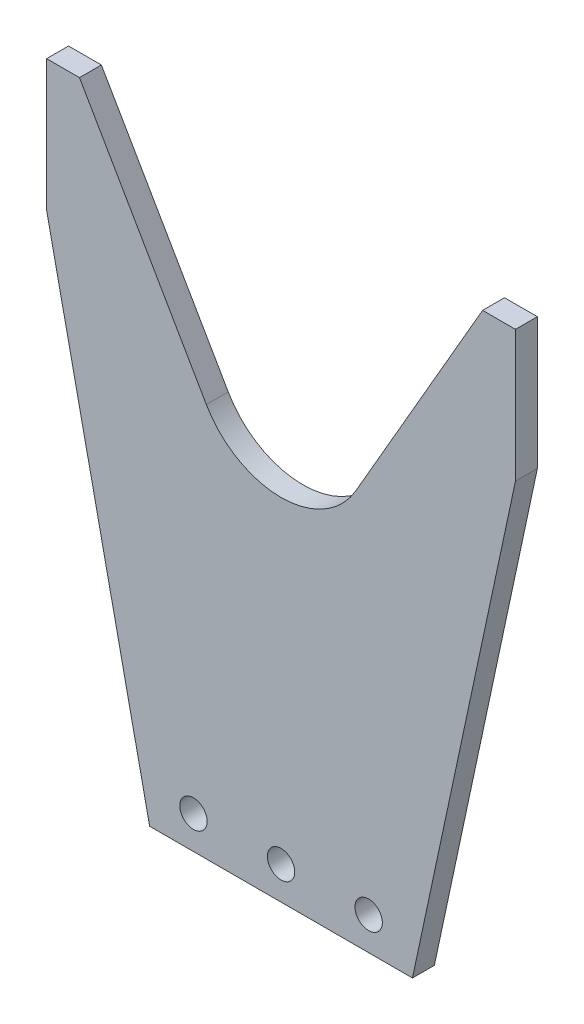
ISO-10303-21;
HEADER;
FILE_DESCRIPTION(('STEP AP214'),'2;1');
FILE_NAME('part.step','',(''),(''),'','','');
FILE_SCHEMA(('AUTOMOTIVE_DESIGN { 1 0 10303 214 1 1 1 1 }'));
ENDSEC;
DATA;
#1=APPLICATION_CONTEXT('core data for automotive mechanical design processes');
#2=APPLICATION_PROTOCOL_DEFINITION('international standard','automotive_design',2000,#1);
#3=PRODUCT_CONTEXT('',#1,'mechanical');
#4=PRODUCT('Part','Part','',(#3));
#5=PRODUCT_RELATED_PRODUCT_CATEGORY('part','',(#4));
#6=PRODUCT_DEFINITION_FORMATION('','',#4);
#7=PRODUCT_DEFINITION_CONTEXT('part definition',#1,'design');
#8=PRODUCT_DEFINITION('design','',#6,#7);
#9=PRODUCT_DEFINITION_SHAPE('','',#8);
#10=(LENGTH_UNIT() NAMED_UNIT(*) SI_UNIT(.MILLI.,.METRE.));
#11=(NAMED_UNIT(*) PLANE_ANGLE_UNIT() SI_UNIT($,.RADIAN.));
#12=(NAMED_UNIT(*) SI_UNIT($,.STERADIAN.) SOLID_ANGLE_UNIT());
#13=UNCERTAINTY_MEASURE_WITH_UNIT(LENGTH_MEASURE(1.E-05),#10,'distance_accuracy_value','');
#14=(GEOMETRIC_REPRESENTATION_CONTEXT(3) GLOBAL_UNCERTAINTY_ASSIGNED_CONTEXT((#13)) GLOBAL_UNIT_ASSIGNED_CONTEXT((#10,
#11,#12)) REPRESENTATION_CONTEXT('',''));
#15=CARTESIAN_POINT('',(0.,0.,0.));
#16=DIRECTION('',(0.,0.,1.));
#17=DIRECTION('',(1.,0.,0.));
#18=AXIS2_PLACEMENT_3D('',#15,#16,#17);
#19=CARTESIAN_POINT('',(0.,0.,6.35));
#20=DIRECTION('',(0.,0.,-1.));
#21=DIRECTION('',(-1.,0.,0.));
#22=AXIS2_PLACEMENT_3D('',#19,#20,#21);
#23=CYLINDRICAL_SURFACE('',#22,25.019);
#24=CARTESIAN_POINT('',(0.,0.,0.));
#25=DIRECTION('',(0.,0.,-1.));
#26=DIRECTION('',(1.,0.,0.));
#27=AXIS2_PLACEMENT_3D('',#24,#25,#26);
#28=CIRCLE('',#27,25.019);
#29=CARTESIAN_POINT('',(21.6670895772829,-12.5094999999999,0.));
#30=VERTEX_POINT('',#29);
#31=CARTESIAN_POINT('',(-21.6670895772829,-12.5095,0.));
#32=VERTEX_POINT('',#31);
#33=EDGE_CURVE('E143',#30,#32,#28,.T.);
#34=ORIENTED_EDGE('',*,*,#33,.T.);
#35=DIRECTION('',(0.,0.,-1.));
#36=VECTOR('',#35,1.);
#37=CARTESIAN_POINT('',(-21.6670895772829,-12.5095,6.35));
#38=LINE('',#37,#36);
#39=CARTESIAN_POINT('',(-21.6670895772829,-12.5095,6.35));
#40=VERTEX_POINT('',#39);
#41=EDGE_CURVE('E11',#40,#32,#38,.T.);
#42=ORIENTED_EDGE('',*,*,#41,.F.);
#43=CARTESIAN_POINT('',(0.,0.,6.35));
#44=DIRECTION('',(0.,0.,-1.));
#45=DIRECTION('',(1.,0.,0.));
#46=AXIS2_PLACEMENT_3D('',#43,#44,#45);
#47=CIRCLE('',#46,25.019);
#48=CARTESIAN_POINT('',(21.6670895772829,-12.5094999999999,6.35));
#49=VERTEX_POINT('',#48);
#50=EDGE_CURVE('E162',#49,#40,#47,.T.);
#51=ORIENTED_EDGE('',*,*,#50,.F.);
#52=DIRECTION('',(0.,0.,-1.));
#53=VECTOR('',#52,1.);
#54=CARTESIAN_POINT('',(21.6670895772829,-12.5094999999999,6.35));
#55=LINE('',#54,#53);
#56=EDGE_CURVE('E139',#49,#30,#55,.T.);
#57=ORIENTED_EDGE('',*,*,#56,.T.);
#58=EDGE_LOOP('',(#34,#42,#51,#57));
#59=FACE_BOUND('',#58,.T.);
#60=ADVANCED_FACE('F35',(#59),#23,.F.);
#61=CARTESIAN_POINT('',(-21.6670895772829,-12.5095,6.35));
#62=DIRECTION('',(-0.866025403784439,-0.499999999999998,0.));
#63=DIRECTION('',(0.499999999999998,-0.86602540378444,0.));
#64=AXIS2_PLACEMENT_3D('',#61,#62,#63);
#65=PLANE('',#64);
#66=DIRECTION('',(-0.499999999999998,0.86602540378444,0.));
#67=VECTOR('',#66,1.);
#68=CARTESIAN_POINT('',(-21.6670895772829,-12.5095,0.));
#69=LINE('',#68,#67);
#70=CARTESIAN_POINT('',(-58.4388168971046,51.181,0.));
#71=VERTEX_POINT('',#70);
#72=EDGE_CURVE('E146',#32,#71,#69,.T.);
#73=ORIENTED_EDGE('',*,*,#72,.T.);
#74=DIRECTION('',(0.,0.,-1.));
#75=VECTOR('',#74,1.);
#76=CARTESIAN_POINT('',(-58.4388168971046,51.181,6.35));
#77=LINE('',#76,#75);
#78=CARTESIAN_POINT('',(-58.4388168971046,51.181,6.35));
#79=VERTEX_POINT('',#78);
#80=EDGE_CURVE('E43',#79,#71,#77,.T.);
#81=ORIENTED_EDGE('',*,*,#80,.F.);
#82=DIRECTION('',(-0.499999999999998,0.86602540378444,0.));
#83=VECTOR('',#82,1.);
#84=CARTESIAN_POINT('',(-21.6670895772829,-12.5095,6.35));
#85=LINE('',#84,#83);
#86=EDGE_CURVE('E100',#40,#79,#85,.T.);
#87=ORIENTED_EDGE('',*,*,#86,.F.);
#88=ORIENTED_EDGE('',*,*,#41,.T.);
#89=EDGE_LOOP('',(#73,#81,#87,#88));
#90=FACE_BOUND('',#89,.T.);
#91=ADVANCED_FACE('F253',(#90),#65,.F.);
#92=CARTESIAN_POINT('',(-58.4388168971046,51.181,6.35));
#93=DIRECTION('',(0.,-1.,0.));
#94=DIRECTION('',(1.,0.,0.));
#95=AXIS2_PLACEMENT_3D('',#92,#93,#94);
#96=PLANE('',#95);
#97=DIRECTION('',(-1.,0.,0.));
#98=VECTOR('',#97,1.);
#99=CARTESIAN_POINT('',(-58.4388168971046,51.181,0.));
#100=LINE('',#99,#98);
#101=CARTESIAN_POINT('',(-67.9638168971046,51.181,0.));
#102=VERTEX_POINT('',#101);
#103=EDGE_CURVE('E149',#71,#102,#100,.T.);
#104=ORIENTED_EDGE('',*,*,#103,.T.);
#105=DIRECTION('',(0.,0.,-1.));
#106=VECTOR('',#105,1.);
#107=CARTESIAN_POINT('',(-67.9638168971046,51.181,6.35));
#108=LINE('',#107,#106);
#109=CARTESIAN_POINT('',(-67.9638168971046,51.181,6.35));
#110=VERTEX_POINT('',#109);
#111=EDGE_CURVE('E175',#110,#102,#108,.T.);
#112=ORIENTED_EDGE('',*,*,#111,.F.);
#113=DIRECTION('',(-1.,0.,0.));
#114=VECTOR('',#113,1.);
#115=CARTESIAN_POINT('',(-58.4388168971046,51.181,6.35));
#116=LINE('',#115,#114);
#117=EDGE_CURVE('E183',#79,#110,#116,.T.);
#118=ORIENTED_EDGE('',*,*,#117,.F.);
#119=ORIENTED_EDGE('',*,*,#80,.T.);
#120=EDGE_LOOP('',(#104,#112,#118,#119));
#121=FACE_BOUND('',#120,.T.);
#122=ADVANCED_FACE('F181',(#121),#96,.F.);
#123=CARTESIAN_POINT('',(-67.9638168971046,51.181,6.35));
#124=DIRECTION('',(1.,0.,0.));
#125=DIRECTION('',(0.,1.,0.));
#126=AXIS2_PLACEMENT_3D('',#123,#124,#125);
#127=PLANE('',#126);
#128=DIRECTION('',(0.,-1.,0.));
#129=VECTOR('',#128,1.);
#130=CARTESIAN_POINT('',(-67.9638168971046,51.181,0.));
#131=LINE('',#130,#129);
#132=CARTESIAN_POINT('',(-67.9638168971046,13.081,0.));
#133=VERTEX_POINT('',#132);
#134=EDGE_CURVE('E151',#102,#133,#131,.T.);
#135=ORIENTED_EDGE('',*,*,#134,.T.);
#136=DIRECTION('',(0.,0.,-1.));
#137=VECTOR('',#136,1.);
#138=CARTESIAN_POINT('',(-67.9638168971046,13.081,6.35));
#139=LINE('',#138,#137);
#140=CARTESIAN_POINT('',(-67.9638168971046,13.081,6.35));
#141=VERTEX_POINT('',#140);
#142=EDGE_CURVE('E172',#141,#133,#139,.T.);
#143=ORIENTED_EDGE('',*,*,#142,.F.);
#144=DIRECTION('',(0.,-1.,0.));
#145=VECTOR('',#144,1.);
#146=CARTESIAN_POINT('',(-67.9638168971046,51.181,6.35));
#147=LINE('',#146,#145);
#148=EDGE_CURVE('E201',#110,#141,#147,.T.);
#149=ORIENTED_EDGE('',*,*,#148,.F.);
#150=ORIENTED_EDGE('',*,*,#111,.T.);
#151=EDGE_LOOP('',(#135,#143,#149,#150));
#152=FACE_BOUND('',#151,.T.);
#153=ADVANCED_FACE('F192',(#152),#127,.F.);
#154=CARTESIAN_POINT('',(-38.1,-126.619,6.35));
#155=DIRECTION('',(0.977905407624772,0.209047874273405,0.));
#156=DIRECTION('',(-0.209047874273405,0.977905407624772,0.));
#157=AXIS2_PLACEMENT_3D('',#154,#155,#156);
#158=PLANE('',#157);
#159=DIRECTION('',(0.209047874273405,-0.977905407624772,0.));
#160=VECTOR('',#159,1.);
#161=CARTESIAN_POINT('',(-38.1,-126.619,0.));
#162=LINE('',#161,#160);
#163=CARTESIAN_POINT('',(-38.1,-126.619,0.));
#164=VERTEX_POINT('',#163);
#165=EDGE_CURVE('E153',#133,#164,#162,.T.);
#166=ORIENTED_EDGE('',*,*,#165,.T.);
#167=DIRECTION('',(0.,0.,-1.));
#168=VECTOR('',#167,1.);
#169=CARTESIAN_POINT('',(-38.1,-126.619,6.35));
#170=LINE('',#169,#168);
#171=CARTESIAN_POINT('',(-38.1,-126.619,6.35));
#172=VERTEX_POINT('',#171);
#173=EDGE_CURVE('E169',#172,#164,#170,.T.);
#174=ORIENTED_EDGE('',*,*,#173,.F.);
#175=DIRECTION('',(0.209047874273405,-0.977905407624772,0.));
#176=VECTOR('',#175,1.);
#177=CARTESIAN_POINT('',(-38.1,-126.619,6.35));
#178=LINE('',#177,#176);
#179=EDGE_CURVE('E198',#141,#172,#178,.T.);
#180=ORIENTED_EDGE('',*,*,#179,.F.);
#181=ORIENTED_EDGE('',*,*,#142,.T.);
#182=EDGE_LOOP('',(#166,#174,#180,#181));
#183=FACE_BOUND('',#182,.T.);
#184=ADVANCED_FACE('F196',(#183),#158,.F.);
#185=CARTESIAN_POINT('',(38.1,-126.619,6.35));
#186=DIRECTION('',(0.,1.,0.));
#187=DIRECTION('',(-1.,0.,0.));
#188=AXIS2_PLACEMENT_3D('',#185,#186,#187);
#189=PLANE('',#188);
#190=DIRECTION('',(1.,0.,0.));
#191=VECTOR('',#190,1.);
#192=CARTESIAN_POINT('',(38.1,-126.619,0.));
#193=LINE('',#192,#191);
#194=CARTESIAN_POINT('',(38.1,-126.619,0.));
#195=VERTEX_POINT('',#194);
#196=EDGE_CURVE('E155',#164,#195,#193,.T.);
#197=ORIENTED_EDGE('',*,*,#196,.T.);
#198=DIRECTION('',(0.,0.,-1.));
#199=VECTOR('',#198,1.);
#200=CARTESIAN_POINT('',(38.1,-126.619,6.35));
#201=LINE('',#200,#199);
#202=CARTESIAN_POINT('',(38.1,-126.619,6.35));
#203=VERTEX_POINT('',#202);
#204=EDGE_CURVE('E166',#203,#195,#201,.T.);
#205=ORIENTED_EDGE('',*,*,#204,.F.);
#206=DIRECTION('',(1.,0.,0.));
#207=VECTOR('',#206,1.);
#208=CARTESIAN_POINT('',(38.1,-126.619,6.35));
#209=LINE('',#208,#207);
#210=EDGE_CURVE('E200',#172,#203,#209,.T.);
#211=ORIENTED_EDGE('',*,*,#210,.F.);
#212=ORIENTED_EDGE('',*,*,#173,.T.);
#213=EDGE_LOOP('',(#197,#205,#211,#212));
#214=FACE_BOUND('',#213,.T.);
#215=ADVANCED_FACE('F265',(#214),#189,.F.);
#216=CARTESIAN_POINT('',(38.1,-126.619,6.35));
#217=DIRECTION('',(-0.977905407624772,0.209047874273404,0.));
#218=DIRECTION('',(-0.209047874273404,-0.977905407624772,0.));
#219=AXIS2_PLACEMENT_3D('',#216,#217,#218);
#220=PLANE('',#219);
#221=DIRECTION('',(0.209047874273404,0.977905407624772,0.));
#222=VECTOR('',#221,1.);
#223=CARTESIAN_POINT('',(38.1,-126.619,0.));
#224=LINE('',#223,#222);
#225=CARTESIAN_POINT('',(67.9638168971046,13.081,0.));
#226=VERTEX_POINT('',#225);
#227=EDGE_CURVE('E157',#195,#226,#224,.T.);
#228=ORIENTED_EDGE('',*,*,#227,.T.);
#229=DIRECTION('',(0.,0.,-1.));
#230=VECTOR('',#229,1.);
#231=CARTESIAN_POINT('',(67.9638168971046,13.081,6.35));
#232=LINE('',#231,#230);
#233=CARTESIAN_POINT('',(67.9638168971046,13.081,6.35));
#234=VERTEX_POINT('',#233);
#235=EDGE_CURVE('E134',#234,#226,#232,.T.);
#236=ORIENTED_EDGE('',*,*,#235,.F.);
#237=DIRECTION('',(0.209047874273404,0.977905407624772,0.));
#238=VECTOR('',#237,1.);
#239=CARTESIAN_POINT('',(38.1,-126.619,6.35));
#240=LINE('',#239,#238);
#241=EDGE_CURVE('E125',#203,#234,#240,.T.);
#242=ORIENTED_EDGE('',*,*,#241,.F.);
#243=ORIENTED_EDGE('',*,*,#204,.T.);
#244=EDGE_LOOP('',(#228,#236,#242,#243));
#245=FACE_BOUND('',#244,.T.);
#246=ADVANCED_FACE('F262',(#245),#220,.F.);
#247=CARTESIAN_POINT('',(67.9638168971046,51.181,6.35));
#248=DIRECTION('',(-1.,0.,0.));
#249=DIRECTION('',(0.,-1.,0.));
#250=AXIS2_PLACEMENT_3D('',#247,#248,#249);
#251=PLANE('',#250);
#252=DIRECTION('',(0.,1.,0.));
#253=VECTOR('',#252,1.);
#254=CARTESIAN_POINT('',(67.9638168971046,51.181,0.));
#255=LINE('',#254,#253);
#256=CARTESIAN_POINT('',(67.9638168971046,51.181,0.));
#257=VERTEX_POINT('',#256);
#258=EDGE_CURVE('E133',#226,#257,#255,.T.);
#259=ORIENTED_EDGE('',*,*,#258,.T.);
#260=DIRECTION('',(0.,0.,-1.));
#261=VECTOR('',#260,1.);
#262=CARTESIAN_POINT('',(67.9638168971046,51.181,6.35));
#263=LINE('',#262,#261);
#264=CARTESIAN_POINT('',(67.9638168971046,51.181,6.35));
#265=VERTEX_POINT('',#264);
#266=EDGE_CURVE('E130',#265,#257,#263,.T.);
#267=ORIENTED_EDGE('',*,*,#266,.F.);
#268=DIRECTION('',(0.,1.,0.));
#269=VECTOR('',#268,1.);
#270=CARTESIAN_POINT('',(67.9638168971046,51.181,6.35));
#271=LINE('',#270,#269);
#272=EDGE_CURVE('E119',#234,#265,#271,.T.);
#273=ORIENTED_EDGE('',*,*,#272,.F.);
#274=ORIENTED_EDGE('',*,*,#235,.T.);
#275=EDGE_LOOP('',(#259,#267,#273,#274));
#276=FACE_BOUND('',#275,.T.);
#277=ADVANCED_FACE('F131',(#276),#251,.F.);
#278=CARTESIAN_POINT('',(58.4388168971045,51.181,6.35));
#279=DIRECTION('',(0.,-1.,0.));
#280=DIRECTION('',(1.,0.,0.));
#281=AXIS2_PLACEMENT_3D('',#278,#279,#280);
#282=PLANE('',#281);
#283=DIRECTION('',(-1.,0.,0.));
#284=VECTOR('',#283,1.);
#285=CARTESIAN_POINT('',(58.4388168971045,51.181,0.));
#286=LINE('',#285,#284);
#287=CARTESIAN_POINT('',(58.4388168971045,51.181,0.));
#288=VERTEX_POINT('',#287);
#289=EDGE_CURVE('E86',#257,#288,#286,.T.);
#290=ORIENTED_EDGE('',*,*,#289,.T.);
#291=DIRECTION('',(0.,0.,-1.));
#292=VECTOR('',#291,1.);
#293=CARTESIAN_POINT('',(58.4388168971045,51.181,6.35));
#294=LINE('',#293,#292);
#295=CARTESIAN_POINT('',(58.4388168971045,51.181,6.35));
#296=VERTEX_POINT('',#295);
#297=EDGE_CURVE('E135',#296,#288,#294,.T.);
#298=ORIENTED_EDGE('',*,*,#297,.F.);
#299=DIRECTION('',(-1.,0.,0.));
#300=VECTOR('',#299,1.);
#301=CARTESIAN_POINT('',(58.4388168971045,51.181,6.35));
#302=LINE('',#301,#300);
#303=EDGE_CURVE('E123',#265,#296,#302,.T.);
#304=ORIENTED_EDGE('',*,*,#303,.F.);
#305=ORIENTED_EDGE('',*,*,#266,.T.);
#306=EDGE_LOOP('',(#290,#298,#304,#305));
#307=FACE_BOUND('',#306,.T.);
#308=ADVANCED_FACE('F137',(#307),#282,.F.);
#309=CARTESIAN_POINT('',(21.6670895772829,-12.5094999999999,6.35));
#310=DIRECTION('',(0.86602540378444,-0.499999999999998,0.));
#311=DIRECTION('',(0.499999999999998,0.86602540378444,0.));
#312=AXIS2_PLACEMENT_3D('',#309,#310,#311);
#313=PLANE('',#312);
#314=DIRECTION('',(-0.499999999999998,-0.86602540378444,0.));
#315=VECTOR('',#314,1.);
#316=CARTESIAN_POINT('',(21.6670895772829,-12.5094999999999,0.));
#317=LINE('',#316,#315);
#318=EDGE_CURVE('E92',#288,#30,#317,.T.);
#319=ORIENTED_EDGE('',*,*,#318,.T.);
#320=ORIENTED_EDGE('',*,*,#56,.F.);
#321=DIRECTION('',(-0.499999999999998,-0.86602540378444,0.));
#322=VECTOR('',#321,1.);
#323=CARTESIAN_POINT('',(21.6670895772829,-12.5094999999999,6.35));
#324=LINE('',#323,#322);
#325=EDGE_CURVE('E51',#296,#49,#324,.T.);
#326=ORIENTED_EDGE('',*,*,#325,.F.);
#327=ORIENTED_EDGE('',*,*,#297,.T.);
#328=EDGE_LOOP('',(#319,#320,#326,#327));
#329=FACE_BOUND('',#328,.T.);
#330=ADVANCED_FACE('F231',(#329),#313,.F.);
#331=CARTESIAN_POINT('',(0.,0.,6.35));
#332=DIRECTION('',(0.,0.,1.));
#333=DIRECTION('',(1.,0.,0.));
#334=AXIS2_PLACEMENT_3D('',#331,#332,#333);
#335=PLANE('',#334);
#336=CARTESIAN_POINT('',(-25.4,-117.094,6.35));
#337=DIRECTION('',(0.,0.,1.));
#338=DIRECTION('',(1.,0.,0.));
#339=AXIS2_PLACEMENT_3D('',#336,#337,#338);
#340=CIRCLE('',#339,3.96874999999999);
#341=CARTESIAN_POINT('',(-21.43125,-117.094,6.35));
#342=VERTEX_POINT('',#341);
#343=EDGE_CURVE('E223',#342,#342,#340,.T.);
#344=ORIENTED_EDGE('',*,*,#343,.F.);
#345=EDGE_LOOP('',(#344));
#346=FACE_BOUND('',#345,.T.);
#347=CARTESIAN_POINT('',(25.4,-117.094,6.35));
#348=DIRECTION('',(0.,0.,1.));
#349=DIRECTION('',(1.,0.,0.));
#350=AXIS2_PLACEMENT_3D('',#347,#348,#349);
#351=CIRCLE('',#350,3.96874999999999);
#352=CARTESIAN_POINT('',(29.36875,-117.094,6.35));
#353=VERTEX_POINT('',#352);
#354=EDGE_CURVE('E217',#353,#353,#351,.T.);
#355=ORIENTED_EDGE('',*,*,#354,.F.);
#356=EDGE_LOOP('',(#355));
#357=FACE_BOUND('',#356,.T.);
#358=CARTESIAN_POINT('',(0.,-117.094,6.35));
#359=DIRECTION('',(0.,0.,1.));
#360=DIRECTION('',(1.,0.,0.));
#361=AXIS2_PLACEMENT_3D('',#358,#359,#360);
#362=CIRCLE('',#361,3.96874999999999);
#363=CARTESIAN_POINT('',(3.96874999999999,-117.094,6.35));
#364=VERTEX_POINT('',#363);
#365=EDGE_CURVE('E211',#364,#364,#362,.T.);
#366=ORIENTED_EDGE('',*,*,#365,.F.);
#367=EDGE_LOOP('',(#366));
#368=FACE_BOUND('',#367,.T.);
#369=ORIENTED_EDGE('',*,*,#50,.T.);
#370=ORIENTED_EDGE('',*,*,#86,.T.);
#371=ORIENTED_EDGE('',*,*,#117,.T.);
#372=ORIENTED_EDGE('',*,*,#148,.T.);
#373=ORIENTED_EDGE('',*,*,#179,.T.);
#374=ORIENTED_EDGE('',*,*,#210,.T.);
#375=ORIENTED_EDGE('',*,*,#241,.T.);
#376=ORIENTED_EDGE('',*,*,#272,.T.);
#377=ORIENTED_EDGE('',*,*,#303,.T.);
#378=ORIENTED_EDGE('',*,*,#325,.T.);
#379=EDGE_LOOP('',(#369,#370,#371,#372,#373,#374,#375,#376,#377,#378));
#380=FACE_BOUND('',#379,.T.);
#381=ADVANCED_FACE('F121',(#346,#357,#368,#380),#335,.T.);
#382=CARTESIAN_POINT('',(0.,0.,0.));
#383=DIRECTION('',(0.,0.,1.));
#384=DIRECTION('',(1.,0.,0.));
#385=AXIS2_PLACEMENT_3D('',#382,#383,#384);
#386=PLANE('',#385);
#387=CARTESIAN_POINT('',(-25.4,-117.094,0.));
#388=DIRECTION('',(0.,0.,1.));
#389=DIRECTION('',(1.,0.,0.));
#390=AXIS2_PLACEMENT_3D('',#387,#388,#389);
#391=CIRCLE('',#390,3.96875);
#392=CARTESIAN_POINT('',(-21.43125,-117.094,0.));
#393=VERTEX_POINT('',#392);
#394=EDGE_CURVE('E220',#393,#393,#391,.T.);
#395=ORIENTED_EDGE('',*,*,#394,.T.);
#396=EDGE_LOOP('',(#395));
#397=FACE_BOUND('',#396,.T.);
#398=CARTESIAN_POINT('',(25.4,-117.094,0.));
#399=DIRECTION('',(0.,0.,1.));
#400=DIRECTION('',(1.,0.,0.));
#401=AXIS2_PLACEMENT_3D('',#398,#399,#400);
#402=CIRCLE('',#401,3.96875);
#403=CARTESIAN_POINT('',(29.36875,-117.094,0.));
#404=VERTEX_POINT('',#403);
#405=EDGE_CURVE('E214',#404,#404,#402,.T.);
#406=ORIENTED_EDGE('',*,*,#405,.T.);
#407=EDGE_LOOP('',(#406));
#408=FACE_BOUND('',#407,.T.);
#409=CARTESIAN_POINT('',(0.,-117.094,0.));
#410=DIRECTION('',(0.,0.,1.));
#411=DIRECTION('',(1.,0.,0.));
#412=AXIS2_PLACEMENT_3D('',#409,#410,#411);
#413=CIRCLE('',#412,3.96875);
#414=CARTESIAN_POINT('',(3.96875,-117.094,0.));
#415=VERTEX_POINT('',#414);
#416=EDGE_CURVE('E147',#415,#415,#413,.T.);
#417=ORIENTED_EDGE('',*,*,#416,.T.);
#418=EDGE_LOOP('',(#417));
#419=FACE_BOUND('',#418,.T.);
#420=ORIENTED_EDGE('',*,*,#33,.F.);
#421=ORIENTED_EDGE('',*,*,#318,.F.);
#422=ORIENTED_EDGE('',*,*,#289,.F.);
#423=ORIENTED_EDGE('',*,*,#258,.F.);
#424=ORIENTED_EDGE('',*,*,#227,.F.);
#425=ORIENTED_EDGE('',*,*,#196,.F.);
#426=ORIENTED_EDGE('',*,*,#165,.F.);
#427=ORIENTED_EDGE('',*,*,#134,.F.);
#428=ORIENTED_EDGE('',*,*,#103,.F.);
#429=ORIENTED_EDGE('',*,*,#72,.F.);
#430=EDGE_LOOP('',(#420,#421,#422,#423,#424,#425,#426,#427,#428,#429));
#431=FACE_BOUND('',#430,.T.);
#432=ADVANCED_FACE('F187',(#397,#408,#419,#431),#386,.F.);
#433=CARTESIAN_POINT('',(0.,-117.094,6.35));
#434=DIRECTION('',(0.,0.,1.));
#435=DIRECTION('',(1.,0.,0.));
#436=AXIS2_PLACEMENT_3D('',#433,#434,#435);
#437=CYLINDRICAL_SURFACE('',#436,3.96874999999999);
#438=ORIENTED_EDGE('',*,*,#416,.F.);
#439=EDGE_LOOP('',(#438));
#440=FACE_BOUND('',#439,.T.);
#441=ORIENTED_EDGE('',*,*,#365,.T.);
#442=EDGE_LOOP('',(#441));
#443=FACE_BOUND('',#442,.T.);
#444=ADVANCED_FACE('F237',(#440,#443),#437,.F.);
#445=CARTESIAN_POINT('',(25.4,-117.094,6.35));
#446=DIRECTION('',(0.,0.,1.));
#447=DIRECTION('',(1.,0.,0.));
#448=AXIS2_PLACEMENT_3D('',#445,#446,#447);
#449=CYLINDRICAL_SURFACE('',#448,3.96874999999999);
#450=ORIENTED_EDGE('',*,*,#405,.F.);
#451=EDGE_LOOP('',(#450));
#452=FACE_BOUND('',#451,.T.);
#453=ORIENTED_EDGE('',*,*,#354,.T.);
#454=EDGE_LOOP('',(#453));
#455=FACE_BOUND('',#454,.T.);
#456=ADVANCED_FACE('F239',(#452,#455),#449,.F.);
#457=CARTESIAN_POINT('',(-25.4,-117.094,6.35));
#458=DIRECTION('',(0.,0.,1.));
#459=DIRECTION('',(1.,0.,0.));
#460=AXIS2_PLACEMENT_3D('',#457,#458,#459);
#461=CYLINDRICAL_SURFACE('',#460,3.96874999999999);
#462=ORIENTED_EDGE('',*,*,#394,.F.);
#463=EDGE_LOOP('',(#462));
#464=FACE_BOUND('',#463,.T.);
#465=ORIENTED_EDGE('',*,*,#343,.T.);
#466=EDGE_LOOP('',(#465));
#467=FACE_BOUND('',#466,.T.);
#468=ADVANCED_FACE('F227',(#464,#467),#461,.F.);
#469=CLOSED_SHELL('',(#60,#91,#122,#153,#184,#215,#246,#277,#308,#330,#381,#432,#444,#456,#468));
#470=MANIFOLD_SOLID_BREP('B2',#469);
#471=ADVANCED_BREP_SHAPE_REPRESENTATION('',(#18,#470),#14);
#472=SHAPE_DEFINITION_REPRESENTATION(#9,#471);
ENDSEC;
END-ISO-10303-21;
